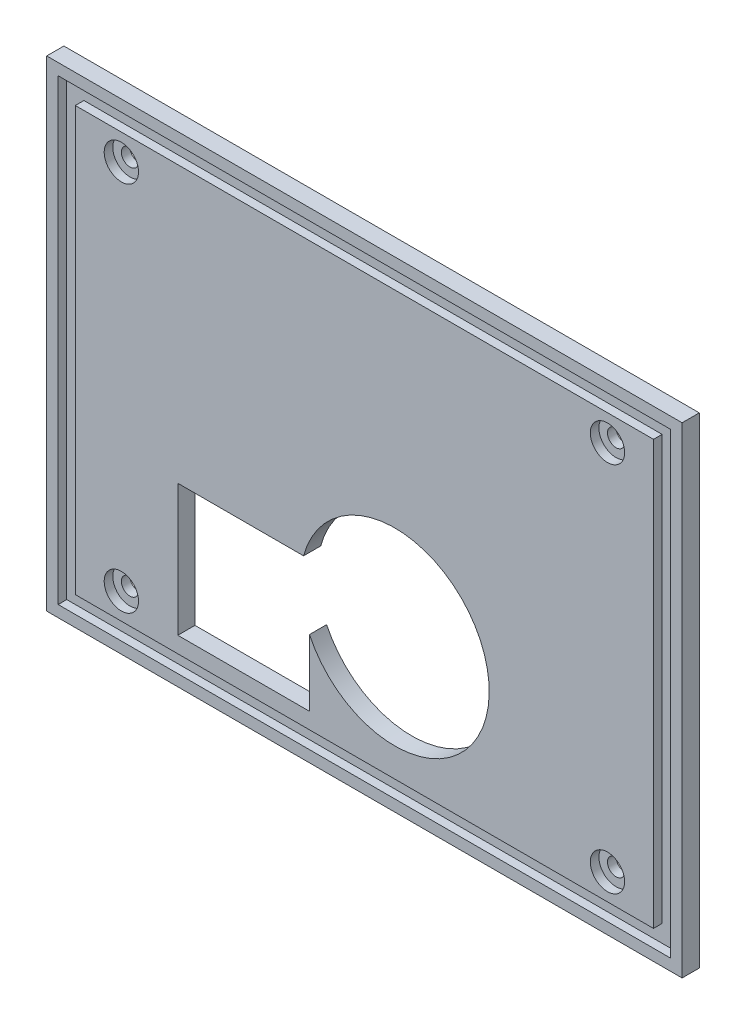
ISO-10303-21;
HEADER;
FILE_DESCRIPTION(('STEP AP214'),'2;1');
FILE_NAME('part.step','',(''),(''),'','','');
FILE_SCHEMA(('AUTOMOTIVE_DESIGN { 1 0 10303 214 1 1 1 1 }'));
ENDSEC;
DATA;
#1=APPLICATION_CONTEXT('core data for automotive mechanical design processes');
#2=APPLICATION_PROTOCOL_DEFINITION('international standard','automotive_design',2000,#1);
#3=PRODUCT_CONTEXT('',#1,'mechanical');
#4=PRODUCT('Part','Part','',(#3));
#5=PRODUCT_RELATED_PRODUCT_CATEGORY('part','',(#4));
#6=PRODUCT_DEFINITION_FORMATION('','',#4);
#7=PRODUCT_DEFINITION_CONTEXT('part definition',#1,'design');
#8=PRODUCT_DEFINITION('design','',#6,#7);
#9=PRODUCT_DEFINITION_SHAPE('','',#8);
#10=(LENGTH_UNIT() NAMED_UNIT(*) SI_UNIT(.MILLI.,.METRE.));
#11=(NAMED_UNIT(*) PLANE_ANGLE_UNIT() SI_UNIT($,.RADIAN.));
#12=(NAMED_UNIT(*) SI_UNIT($,.STERADIAN.) SOLID_ANGLE_UNIT());
#13=UNCERTAINTY_MEASURE_WITH_UNIT(LENGTH_MEASURE(1.E-05),#10,'distance_accuracy_value','');
#14=(GEOMETRIC_REPRESENTATION_CONTEXT(3) GLOBAL_UNCERTAINTY_ASSIGNED_CONTEXT((#13)) GLOBAL_UNIT_ASSIGNED_CONTEXT((#10,
#11,#12)) REPRESENTATION_CONTEXT('',''));
#15=CARTESIAN_POINT('',(0.,0.,0.));
#16=DIRECTION('',(0.,0.,1.));
#17=DIRECTION('',(1.,0.,0.));
#18=AXIS2_PLACEMENT_3D('',#15,#16,#17);
#19=CARTESIAN_POINT('',(0.,0.,0.));
#20=DIRECTION('',(0.,0.,-1.));
#21=DIRECTION('',(-1.,0.,0.));
#22=AXIS2_PLACEMENT_3D('',#19,#20,#21);
#23=PLANE('',#22);
#24=CARTESIAN_POINT('',(95.96,7.54,0.));
#25=DIRECTION('',(0.,0.,1.));
#26=DIRECTION('',(1.,0.,0.));
#27=AXIS2_PLACEMENT_3D('',#24,#25,#26);
#28=CIRCLE('',#27,1.5);
#29=CARTESIAN_POINT('',(97.46,7.54,0.));
#30=VERTEX_POINT('',#29);
#31=EDGE_CURVE('E199',#30,#30,#28,.T.);
#32=ORIENTED_EDGE('',*,*,#31,.T.);
#33=EDGE_LOOP('',(#32));
#34=FACE_BOUND('',#33,.T.);
#35=CARTESIAN_POINT('',(11.04,72.46,0.));
#36=DIRECTION('',(0.,0.,1.));
#37=DIRECTION('',(1.,0.,0.));
#38=AXIS2_PLACEMENT_3D('',#35,#36,#37);
#39=CIRCLE('',#38,1.5);
#40=CARTESIAN_POINT('',(12.54,72.46,0.));
#41=VERTEX_POINT('',#40);
#42=EDGE_CURVE('E198',#41,#41,#39,.T.);
#43=ORIENTED_EDGE('',*,*,#42,.T.);
#44=EDGE_LOOP('',(#43));
#45=FACE_BOUND('',#44,.T.);
#46=CARTESIAN_POINT('',(95.96,72.46,0.));
#47=DIRECTION('',(0.,0.,1.));
#48=DIRECTION('',(1.,0.,0.));
#49=AXIS2_PLACEMENT_3D('',#46,#47,#48);
#50=CIRCLE('',#49,1.5);
#51=CARTESIAN_POINT('',(97.46,72.46,0.));
#52=VERTEX_POINT('',#51);
#53=EDGE_CURVE('E195',#52,#52,#50,.T.);
#54=ORIENTED_EDGE('',*,*,#53,.T.);
#55=EDGE_LOOP('',(#54));
#56=FACE_BOUND('',#55,.T.);
#57=CARTESIAN_POINT('',(11.04,7.54,0.));
#58=DIRECTION('',(0.,0.,1.));
#59=DIRECTION('',(1.,0.,0.));
#60=AXIS2_PLACEMENT_3D('',#57,#58,#59);
#61=CIRCLE('',#60,1.5);
#62=CARTESIAN_POINT('',(12.54,7.54,0.));
#63=VERTEX_POINT('',#62);
#64=EDGE_CURVE('E202',#63,#63,#61,.T.);
#65=ORIENTED_EDGE('',*,*,#64,.T.);
#66=EDGE_LOOP('',(#65));
#67=FACE_BOUND('',#66,.T.);
#68=DIRECTION('',(-1.,0.,0.));
#69=VECTOR('',#68,1.);
#70=CARTESIAN_POINT('',(-2.,82.,0.));
#71=LINE('',#70,#69);
#72=CARTESIAN_POINT('',(109.,82.,0.));
#73=VERTEX_POINT('',#72);
#74=CARTESIAN_POINT('',(-2.,82.,0.));
#75=VERTEX_POINT('',#74);
#76=EDGE_CURVE('E310',#73,#75,#71,.T.);
#77=ORIENTED_EDGE('',*,*,#76,.F.);
#78=DIRECTION('',(0.,1.,0.));
#79=VECTOR('',#78,1.);
#80=CARTESIAN_POINT('',(109.,-2.,0.));
#81=LINE('',#80,#79);
#82=CARTESIAN_POINT('',(109.,-2.,0.));
#83=VERTEX_POINT('',#82);
#84=EDGE_CURVE('E308',#83,#73,#81,.T.);
#85=ORIENTED_EDGE('',*,*,#84,.F.);
#86=DIRECTION('',(1.,0.,0.));
#87=VECTOR('',#86,1.);
#88=CARTESIAN_POINT('',(-2.,-2.,0.));
#89=LINE('',#88,#87);
#90=CARTESIAN_POINT('',(-2.,-2.,0.));
#91=VERTEX_POINT('',#90);
#92=EDGE_CURVE('E306',#91,#83,#89,.T.);
#93=ORIENTED_EDGE('',*,*,#92,.F.);
#94=DIRECTION('',(0.,-1.,0.));
#95=VECTOR('',#94,1.);
#96=CARTESIAN_POINT('',(-2.,-2.,0.));
#97=LINE('',#96,#95);
#98=EDGE_CURVE('E304',#75,#91,#97,.T.);
#99=ORIENTED_EDGE('',*,*,#98,.F.);
#100=EDGE_LOOP('',(#77,#85,#93,#99));
#101=FACE_BOUND('',#100,.T.);
#102=DIRECTION('',(1.,0.,0.));
#103=VECTOR('',#102,1.);
#104=CARTESIAN_POINT('',(20.9,5.8,0.));
#105=LINE('',#104,#103);
#106=CARTESIAN_POINT('',(20.9,5.8,0.));
#107=VERTEX_POINT('',#106);
#108=CARTESIAN_POINT('',(43.9,5.8,0.));
#109=VERTEX_POINT('',#108);
#110=EDGE_CURVE('E173',#107,#109,#105,.T.);
#111=ORIENTED_EDGE('',*,*,#110,.T.);
#112=DIRECTION('',(0.,1.,0.));
#113=VECTOR('',#112,1.);
#114=CARTESIAN_POINT('',(43.9,5.8,0.));
#115=LINE('',#114,#113);
#116=CARTESIAN_POINT('',(43.9,17.4119819413322,0.));
#117=VERTEX_POINT('',#116);
#118=EDGE_CURVE('E179',#109,#117,#115,.T.);
#119=ORIENTED_EDGE('',*,*,#118,.T.);
#120=CARTESIAN_POINT('',(58.8,24.5,0.));
#121=DIRECTION('',(0.,0.,1.));
#122=DIRECTION('',(1.,0.,0.));
#123=AXIS2_PLACEMENT_3D('',#120,#121,#122);
#124=CIRCLE('',#123,16.5);
#125=CARTESIAN_POINT('',(42.8701537986081,28.8,0.));
#126=VERTEX_POINT('',#125);
#127=EDGE_CURVE('E192',#117,#126,#124,.T.);
#128=ORIENTED_EDGE('',*,*,#127,.T.);
#129=DIRECTION('',(-1.,0.,0.));
#130=VECTOR('',#129,1.);
#131=CARTESIAN_POINT('',(20.9,28.8,0.));
#132=LINE('',#131,#130);
#133=CARTESIAN_POINT('',(20.9,28.8,0.));
#134=VERTEX_POINT('',#133);
#135=EDGE_CURVE('E56',#126,#134,#132,.T.);
#136=ORIENTED_EDGE('',*,*,#135,.T.);
#137=DIRECTION('',(0.,-1.,0.));
#138=VECTOR('',#137,1.);
#139=CARTESIAN_POINT('',(20.9,5.8,0.));
#140=LINE('',#139,#138);
#141=EDGE_CURVE('E165',#134,#107,#140,.T.);
#142=ORIENTED_EDGE('',*,*,#141,.T.);
#143=EDGE_LOOP('',(#111,#119,#128,#136,#142));
#144=FACE_BOUND('',#143,.T.);
#145=ADVANCED_FACE('F41',(#34,#45,#56,#67,#101,#144),#23,.T.);
#146=CARTESIAN_POINT('',(0.,0.,3.));
#147=DIRECTION('',(0.,0.,-1.));
#148=DIRECTION('',(-1.,0.,0.));
#149=AXIS2_PLACEMENT_3D('',#146,#147,#148);
#150=PLANE('',#149);
#151=CARTESIAN_POINT('',(95.96,72.46,3.));
#152=DIRECTION('',(0.,0.,1.));
#153=DIRECTION('',(1.,0.,0.));
#154=AXIS2_PLACEMENT_3D('',#151,#152,#153);
#155=CIRCLE('',#154,3.00000000000001);
#156=CARTESIAN_POINT('',(98.96,72.46,3.));
#157=VERTEX_POINT('',#156);
#158=EDGE_CURVE('E247',#157,#157,#155,.T.);
#159=ORIENTED_EDGE('',*,*,#158,.F.);
#160=EDGE_LOOP('',(#159));
#161=FACE_BOUND('',#160,.T.);
#162=CARTESIAN_POINT('',(11.04,72.46,3.));
#163=DIRECTION('',(0.,0.,1.));
#164=DIRECTION('',(1.,0.,0.));
#165=AXIS2_PLACEMENT_3D('',#162,#163,#164);
#166=CIRCLE('',#165,3.);
#167=CARTESIAN_POINT('',(14.04,72.46,3.));
#168=VERTEX_POINT('',#167);
#169=EDGE_CURVE('E250',#168,#168,#166,.T.);
#170=ORIENTED_EDGE('',*,*,#169,.F.);
#171=EDGE_LOOP('',(#170));
#172=FACE_BOUND('',#171,.T.);
#173=CARTESIAN_POINT('',(95.96,7.54,3.));
#174=DIRECTION('',(0.,0.,1.));
#175=DIRECTION('',(1.,0.,0.));
#176=AXIS2_PLACEMENT_3D('',#173,#174,#175);
#177=CIRCLE('',#176,3.00000000000001);
#178=CARTESIAN_POINT('',(98.96,7.54,3.));
#179=VERTEX_POINT('',#178);
#180=EDGE_CURVE('E253',#179,#179,#177,.T.);
#181=ORIENTED_EDGE('',*,*,#180,.F.);
#182=EDGE_LOOP('',(#181));
#183=FACE_BOUND('',#182,.T.);
#184=CARTESIAN_POINT('',(11.04,7.54,3.));
#185=DIRECTION('',(0.,0.,1.));
#186=DIRECTION('',(1.,0.,0.));
#187=AXIS2_PLACEMENT_3D('',#184,#185,#186);
#188=CIRCLE('',#187,3.);
#189=CARTESIAN_POINT('',(14.04,7.54,3.));
#190=VERTEX_POINT('',#189);
#191=EDGE_CURVE('E256',#190,#190,#188,.T.);
#192=ORIENTED_EDGE('',*,*,#191,.F.);
#193=EDGE_LOOP('',(#192));
#194=FACE_BOUND('',#193,.T.);
#195=DIRECTION('',(0.,-1.,0.));
#196=VECTOR('',#195,1.);
#197=CARTESIAN_POINT('',(3.,3.,3.));
#198=LINE('',#197,#196);
#199=CARTESIAN_POINT('',(3.,77.,3.));
#200=VERTEX_POINT('',#199);
#201=CARTESIAN_POINT('',(3.,3.,3.));
#202=VERTEX_POINT('',#201);
#203=EDGE_CURVE('E259',#200,#202,#198,.T.);
#204=ORIENTED_EDGE('',*,*,#203,.T.);
#205=DIRECTION('',(1.,0.,0.));
#206=VECTOR('',#205,1.);
#207=CARTESIAN_POINT('',(3.,3.,3.));
#208=LINE('',#207,#206);
#209=CARTESIAN_POINT('',(104.,3.,3.));
#210=VERTEX_POINT('',#209);
#211=EDGE_CURVE('E262',#202,#210,#208,.T.);
#212=ORIENTED_EDGE('',*,*,#211,.T.);
#213=DIRECTION('',(0.,1.,0.));
#214=VECTOR('',#213,1.);
#215=CARTESIAN_POINT('',(104.,3.,3.));
#216=LINE('',#215,#214);
#217=CARTESIAN_POINT('',(104.,77.,3.));
#218=VERTEX_POINT('',#217);
#219=EDGE_CURVE('E264',#210,#218,#216,.T.);
#220=ORIENTED_EDGE('',*,*,#219,.T.);
#221=DIRECTION('',(-1.,0.,0.));
#222=VECTOR('',#221,1.);
#223=CARTESIAN_POINT('',(3.,77.,3.));
#224=LINE('',#223,#222);
#225=EDGE_CURVE('E266',#218,#200,#224,.T.);
#226=ORIENTED_EDGE('',*,*,#225,.T.);
#227=EDGE_LOOP('',(#204,#212,#220,#226));
#228=FACE_BOUND('',#227,.T.);
#229=DIRECTION('',(0.,1.,0.));
#230=VECTOR('',#229,1.);
#231=CARTESIAN_POINT('',(43.9,0.,3.));
#232=LINE('',#231,#230);
#233=CARTESIAN_POINT('',(43.9,5.8,3.));
#234=VERTEX_POINT('',#233);
#235=CARTESIAN_POINT('',(43.9,17.4119819413322,3.));
#236=VERTEX_POINT('',#235);
#237=EDGE_CURVE('E190',#234,#236,#232,.T.);
#238=ORIENTED_EDGE('',*,*,#237,.F.);
#239=DIRECTION('',(1.,0.,0.));
#240=VECTOR('',#239,1.);
#241=CARTESIAN_POINT('',(0.,5.8,3.));
#242=LINE('',#241,#240);
#243=CARTESIAN_POINT('',(20.9,5.8,3.));
#244=VERTEX_POINT('',#243);
#245=EDGE_CURVE('E11',#244,#234,#242,.T.);
#246=ORIENTED_EDGE('',*,*,#245,.F.);
#247=DIRECTION('',(0.,-1.,0.));
#248=VECTOR('',#247,1.);
#249=CARTESIAN_POINT('',(20.9,0.,3.));
#250=LINE('',#249,#248);
#251=CARTESIAN_POINT('',(20.9,28.8,3.));
#252=VERTEX_POINT('',#251);
#253=EDGE_CURVE('E49',#252,#244,#250,.T.);
#254=ORIENTED_EDGE('',*,*,#253,.F.);
#255=DIRECTION('',(-1.,0.,0.));
#256=VECTOR('',#255,1.);
#257=CARTESIAN_POINT('',(0.,28.8,3.));
#258=LINE('',#257,#256);
#259=CARTESIAN_POINT('',(42.8701537986081,28.8,3.));
#260=VERTEX_POINT('',#259);
#261=EDGE_CURVE('E169',#260,#252,#258,.T.);
#262=ORIENTED_EDGE('',*,*,#261,.F.);
#263=CARTESIAN_POINT('',(58.8,24.5,3.));
#264=DIRECTION('',(0.,0.,-1.));
#265=DIRECTION('',(-1.,0.,0.));
#266=AXIS2_PLACEMENT_3D('',#263,#264,#265);
#267=CIRCLE('',#266,16.5);
#268=EDGE_CURVE('E194',#236,#260,#267,.F.);
#269=ORIENTED_EDGE('',*,*,#268,.F.);
#270=EDGE_LOOP('',(#238,#246,#254,#262,#269));
#271=FACE_BOUND('',#270,.T.);
#272=ADVANCED_FACE('F348',(#161,#172,#183,#194,#228,#271),#150,.F.);
#273=CARTESIAN_POINT('',(58.8,24.5,6.));
#274=DIRECTION('',(0.,0.,-1.));
#275=DIRECTION('',(-1.,0.,0.));
#276=AXIS2_PLACEMENT_3D('',#273,#274,#275);
#277=CYLINDRICAL_SURFACE('',#276,16.5);
#278=ORIENTED_EDGE('',*,*,#127,.F.);
#279=DIRECTION('',(0.,0.,-1.));
#280=VECTOR('',#279,1.);
#281=CARTESIAN_POINT('',(43.9,17.4119819413322,6.));
#282=LINE('',#281,#280);
#283=EDGE_CURVE('E338',#117,#236,#282,.F.);
#284=ORIENTED_EDGE('',*,*,#283,.T.);
#285=ORIENTED_EDGE('',*,*,#268,.T.);
#286=DIRECTION('',(0.,0.,-1.));
#287=VECTOR('',#286,1.);
#288=CARTESIAN_POINT('',(42.8701537986081,28.8,6.));
#289=LINE('',#288,#287);
#290=EDGE_CURVE('E324',#260,#126,#289,.T.);
#291=ORIENTED_EDGE('',*,*,#290,.T.);
#292=EDGE_LOOP('',(#278,#284,#285,#291));
#293=FACE_BOUND('',#292,.T.);
#294=ADVANCED_FACE('F343',(#293),#277,.F.);
#295=CARTESIAN_POINT('',(0.,0.,1.5));
#296=DIRECTION('',(0.,0.,-1.));
#297=DIRECTION('',(-1.,0.,0.));
#298=AXIS2_PLACEMENT_3D('',#295,#296,#297);
#299=PLANE('',#298);
#300=DIRECTION('',(0.,-1.,0.));
#301=VECTOR('',#300,1.);
#302=CARTESIAN_POINT('',(3.,0.,1.5));
#303=LINE('',#302,#301);
#304=CARTESIAN_POINT('',(3.,77.,1.5));
#305=VERTEX_POINT('',#304);
#306=CARTESIAN_POINT('',(3.,3.,1.5));
#307=VERTEX_POINT('',#306);
#308=EDGE_CURVE('E301',#305,#307,#303,.T.);
#309=ORIENTED_EDGE('',*,*,#308,.F.);
#310=DIRECTION('',(-1.,0.,0.));
#311=VECTOR('',#310,1.);
#312=CARTESIAN_POINT('',(0.,77.,1.5));
#313=LINE('',#312,#311);
#314=CARTESIAN_POINT('',(104.,77.,1.5));
#315=VERTEX_POINT('',#314);
#316=EDGE_CURVE('E292',#315,#305,#313,.T.);
#317=ORIENTED_EDGE('',*,*,#316,.F.);
#318=DIRECTION('',(0.,1.,0.));
#319=VECTOR('',#318,1.);
#320=CARTESIAN_POINT('',(104.,0.,1.5));
#321=LINE('',#320,#319);
#322=CARTESIAN_POINT('',(104.,3.,1.5));
#323=VERTEX_POINT('',#322);
#324=EDGE_CURVE('E295',#323,#315,#321,.T.);
#325=ORIENTED_EDGE('',*,*,#324,.F.);
#326=DIRECTION('',(1.,0.,0.));
#327=VECTOR('',#326,1.);
#328=CARTESIAN_POINT('',(0.,3.,1.5));
#329=LINE('',#328,#327);
#330=EDGE_CURVE('E298',#307,#323,#329,.T.);
#331=ORIENTED_EDGE('',*,*,#330,.F.);
#332=EDGE_LOOP('',(#309,#317,#325,#331));
#333=FACE_BOUND('',#332,.T.);
#334=DIRECTION('',(0.,-1.,0.));
#335=VECTOR('',#334,1.);
#336=CARTESIAN_POINT('',(107.,0.,1.5));
#337=LINE('',#336,#335);
#338=CARTESIAN_POINT('',(107.,80.,1.5));
#339=VERTEX_POINT('',#338);
#340=CARTESIAN_POINT('',(107.,0.,1.5));
#341=VERTEX_POINT('',#340);
#342=EDGE_CURVE('E216',#339,#341,#337,.T.);
#343=ORIENTED_EDGE('',*,*,#342,.F.);
#344=DIRECTION('',(1.,0.,0.));
#345=VECTOR('',#344,1.);
#346=CARTESIAN_POINT('',(0.,80.,1.5));
#347=LINE('',#346,#345);
#348=CARTESIAN_POINT('',(0.,80.,1.5));
#349=VERTEX_POINT('',#348);
#350=EDGE_CURVE('E232',#349,#339,#347,.T.);
#351=ORIENTED_EDGE('',*,*,#350,.F.);
#352=DIRECTION('',(0.,1.,0.));
#353=VECTOR('',#352,1.);
#354=CARTESIAN_POINT('',(0.,0.,1.5));
#355=LINE('',#354,#353);
#356=CARTESIAN_POINT('',(0.,0.,1.5));
#357=VERTEX_POINT('',#356);
#358=EDGE_CURVE('E224',#357,#349,#355,.T.);
#359=ORIENTED_EDGE('',*,*,#358,.F.);
#360=DIRECTION('',(-1.,0.,0.));
#361=VECTOR('',#360,1.);
#362=CARTESIAN_POINT('',(0.,0.,1.5));
#363=LINE('',#362,#361);
#364=EDGE_CURVE('E245',#341,#357,#363,.T.);
#365=ORIENTED_EDGE('',*,*,#364,.F.);
#366=EDGE_LOOP('',(#343,#351,#359,#365));
#367=FACE_BOUND('',#366,.T.);
#368=ADVANCED_FACE('F371',(#333,#367),#299,.F.);
#369=CARTESIAN_POINT('',(-2.,0.,3.));
#370=DIRECTION('',(0.,-1.,0.));
#371=DIRECTION('',(0.,0.,-1.));
#372=AXIS2_PLACEMENT_3D('',#369,#370,#371);
#373=PLANE('',#372);
#374=DIRECTION('',(0.,0.,-1.));
#375=VECTOR('',#374,1.);
#376=CARTESIAN_POINT('',(107.,0.,3.));
#377=LINE('',#376,#375);
#378=CARTESIAN_POINT('',(107.,0.,3.));
#379=VERTEX_POINT('',#378);
#380=EDGE_CURVE('E213',#379,#341,#377,.T.);
#381=ORIENTED_EDGE('',*,*,#380,.T.);
#382=ORIENTED_EDGE('',*,*,#364,.T.);
#383=DIRECTION('',(0.,0.,-1.));
#384=VECTOR('',#383,1.);
#385=CARTESIAN_POINT('',(0.,0.,3.));
#386=LINE('',#385,#384);
#387=CARTESIAN_POINT('',(0.,0.,3.));
#388=VERTEX_POINT('',#387);
#389=EDGE_CURVE('E221',#388,#357,#386,.T.);
#390=ORIENTED_EDGE('',*,*,#389,.F.);
#391=DIRECTION('',(-1.,0.,0.));
#392=VECTOR('',#391,1.);
#393=CARTESIAN_POINT('',(-2.,0.,3.));
#394=LINE('',#393,#392);
#395=EDGE_CURVE('E243',#379,#388,#394,.T.);
#396=ORIENTED_EDGE('',*,*,#395,.F.);
#397=EDGE_LOOP('',(#381,#382,#390,#396));
#398=FACE_BOUND('',#397,.T.);
#399=ADVANCED_FACE('F419',(#398),#373,.F.);
#400=CARTESIAN_POINT('',(-2.,80.,3.));
#401=DIRECTION('',(0.,1.,0.));
#402=DIRECTION('',(0.,0.,1.));
#403=AXIS2_PLACEMENT_3D('',#400,#401,#402);
#404=PLANE('',#403);
#405=DIRECTION('',(0.,0.,-1.));
#406=VECTOR('',#405,1.);
#407=CARTESIAN_POINT('',(107.,80.,3.));
#408=LINE('',#407,#406);
#409=CARTESIAN_POINT('',(107.,80.,3.));
#410=VERTEX_POINT('',#409);
#411=EDGE_CURVE('E210',#410,#339,#408,.T.);
#412=ORIENTED_EDGE('',*,*,#411,.F.);
#413=DIRECTION('',(1.,0.,0.));
#414=VECTOR('',#413,1.);
#415=CARTESIAN_POINT('',(-2.,80.,3.));
#416=LINE('',#415,#414);
#417=CARTESIAN_POINT('',(0.,80.,3.));
#418=VERTEX_POINT('',#417);
#419=EDGE_CURVE('E226',#418,#410,#416,.T.);
#420=ORIENTED_EDGE('',*,*,#419,.F.);
#421=DIRECTION('',(0.,0.,-1.));
#422=VECTOR('',#421,1.);
#423=CARTESIAN_POINT('',(0.,80.,3.));
#424=LINE('',#423,#422);
#425=EDGE_CURVE('E64',#418,#349,#424,.T.);
#426=ORIENTED_EDGE('',*,*,#425,.T.);
#427=ORIENTED_EDGE('',*,*,#350,.T.);
#428=EDGE_LOOP('',(#412,#420,#426,#427));
#429=FACE_BOUND('',#428,.T.);
#430=ADVANCED_FACE('F388',(#429),#404,.F.);
#431=CARTESIAN_POINT('',(-2.,-2.,1.5));
#432=DIRECTION('',(1.,0.,0.));
#433=DIRECTION('',(0.,0.,-1.));
#434=AXIS2_PLACEMENT_3D('',#431,#432,#433);
#435=PLANE('',#434);
#436=ORIENTED_EDGE('',*,*,#98,.T.);
#437=DIRECTION('',(0.,0.,-1.));
#438=VECTOR('',#437,1.);
#439=CARTESIAN_POINT('',(-2.,-2.,1.5));
#440=LINE('',#439,#438);
#441=CARTESIAN_POINT('',(-2.,-2.,3.));
#442=VERTEX_POINT('',#441);
#443=EDGE_CURVE('E321',#442,#91,#440,.T.);
#444=ORIENTED_EDGE('',*,*,#443,.F.);
#445=DIRECTION('',(0.,-1.,0.));
#446=VECTOR('',#445,1.);
#447=CARTESIAN_POINT('',(-2.,-2.,3.));
#448=LINE('',#447,#446);
#449=CARTESIAN_POINT('',(-2.,82.,3.));
#450=VERTEX_POINT('',#449);
#451=EDGE_CURVE('E235',#450,#442,#448,.T.);
#452=ORIENTED_EDGE('',*,*,#451,.F.);
#453=DIRECTION('',(0.,0.,-1.));
#454=VECTOR('',#453,1.);
#455=CARTESIAN_POINT('',(-2.,82.,1.5));
#456=LINE('',#455,#454);
#457=EDGE_CURVE('E312',#450,#75,#456,.T.);
#458=ORIENTED_EDGE('',*,*,#457,.T.);
#459=EDGE_LOOP('',(#436,#444,#452,#458));
#460=FACE_BOUND('',#459,.T.);
#461=ADVANCED_FACE('F43',(#460),#435,.F.);
#462=CARTESIAN_POINT('',(-2.,-2.,1.5));
#463=DIRECTION('',(0.,1.,0.));
#464=DIRECTION('',(0.,0.,1.));
#465=AXIS2_PLACEMENT_3D('',#462,#463,#464);
#466=PLANE('',#465);
#467=ORIENTED_EDGE('',*,*,#92,.T.);
#468=DIRECTION('',(0.,0.,-1.));
#469=VECTOR('',#468,1.);
#470=CARTESIAN_POINT('',(109.,-2.,1.5));
#471=LINE('',#470,#469);
#472=CARTESIAN_POINT('',(109.,-2.,3.));
#473=VERTEX_POINT('',#472);
#474=EDGE_CURVE('E318',#473,#83,#471,.T.);
#475=ORIENTED_EDGE('',*,*,#474,.F.);
#476=DIRECTION('',(1.,0.,0.));
#477=VECTOR('',#476,1.);
#478=CARTESIAN_POINT('',(-2.,-2.,3.));
#479=LINE('',#478,#477);
#480=EDGE_CURVE('E238',#442,#473,#479,.T.);
#481=ORIENTED_EDGE('',*,*,#480,.F.);
#482=ORIENTED_EDGE('',*,*,#443,.T.);
#483=EDGE_LOOP('',(#467,#475,#481,#482));
#484=FACE_BOUND('',#483,.T.);
#485=ADVANCED_FACE('F380',(#484),#466,.F.);
#486=CARTESIAN_POINT('',(109.,-2.,1.5));
#487=DIRECTION('',(-1.,0.,0.));
#488=DIRECTION('',(0.,0.,1.));
#489=AXIS2_PLACEMENT_3D('',#486,#487,#488);
#490=PLANE('',#489);
#491=DIRECTION('',(0.,0.,-1.));
#492=VECTOR('',#491,1.);
#493=CARTESIAN_POINT('',(109.,82.,1.5));
#494=LINE('',#493,#492);
#495=CARTESIAN_POINT('',(109.,82.,3.));
#496=VERTEX_POINT('',#495);
#497=EDGE_CURVE('E315',#496,#73,#494,.T.);
#498=ORIENTED_EDGE('',*,*,#497,.F.);
#499=DIRECTION('',(0.,1.,0.));
#500=VECTOR('',#499,1.);
#501=CARTESIAN_POINT('',(109.,-2.,3.));
#502=LINE('',#501,#500);
#503=EDGE_CURVE('E241',#473,#496,#502,.T.);
#504=ORIENTED_EDGE('',*,*,#503,.F.);
#505=ORIENTED_EDGE('',*,*,#474,.T.);
#506=ORIENTED_EDGE('',*,*,#84,.T.);
#507=EDGE_LOOP('',(#498,#504,#505,#506));
#508=FACE_BOUND('',#507,.T.);
#509=ADVANCED_FACE('F377',(#508),#490,.F.);
#510=CARTESIAN_POINT('',(-2.,82.,1.5));
#511=DIRECTION('',(0.,-1.,0.));
#512=DIRECTION('',(0.,0.,-1.));
#513=AXIS2_PLACEMENT_3D('',#510,#511,#512);
#514=PLANE('',#513);
#515=ORIENTED_EDGE('',*,*,#76,.T.);
#516=ORIENTED_EDGE('',*,*,#457,.F.);
#517=DIRECTION('',(-1.,0.,0.));
#518=VECTOR('',#517,1.);
#519=CARTESIAN_POINT('',(-2.,82.,3.));
#520=LINE('',#519,#518);
#521=EDGE_CURVE('E229',#496,#450,#520,.T.);
#522=ORIENTED_EDGE('',*,*,#521,.F.);
#523=ORIENTED_EDGE('',*,*,#497,.T.);
#524=EDGE_LOOP('',(#515,#516,#522,#523));
#525=FACE_BOUND('',#524,.T.);
#526=ADVANCED_FACE('F373',(#525),#514,.F.);
#527=CARTESIAN_POINT('',(3.,3.,3.));
#528=DIRECTION('',(1.,0.,0.));
#529=DIRECTION('',(0.,0.,-1.));
#530=AXIS2_PLACEMENT_3D('',#527,#528,#529);
#531=PLANE('',#530);
#532=DIRECTION('',(0.,0.,-1.));
#533=VECTOR('',#532,1.);
#534=CARTESIAN_POINT('',(3.,77.,3.));
#535=LINE('',#534,#533);
#536=EDGE_CURVE('E268',#200,#305,#535,.T.);
#537=ORIENTED_EDGE('',*,*,#536,.T.);
#538=ORIENTED_EDGE('',*,*,#308,.T.);
#539=DIRECTION('',(0.,0.,-1.));
#540=VECTOR('',#539,1.);
#541=CARTESIAN_POINT('',(3.,3.,3.));
#542=LINE('',#541,#540);
#543=EDGE_CURVE('E277',#202,#307,#542,.T.);
#544=ORIENTED_EDGE('',*,*,#543,.F.);
#545=ORIENTED_EDGE('',*,*,#203,.F.);
#546=EDGE_LOOP('',(#537,#538,#544,#545));
#547=FACE_BOUND('',#546,.T.);
#548=ADVANCED_FACE('F376',(#547),#531,.F.);
#549=CARTESIAN_POINT('',(3.,3.,3.));
#550=DIRECTION('',(0.,1.,0.));
#551=DIRECTION('',(0.,0.,1.));
#552=AXIS2_PLACEMENT_3D('',#549,#550,#551);
#553=PLANE('',#552);
#554=ORIENTED_EDGE('',*,*,#543,.T.);
#555=ORIENTED_EDGE('',*,*,#330,.T.);
#556=DIRECTION('',(0.,0.,-1.));
#557=VECTOR('',#556,1.);
#558=CARTESIAN_POINT('',(104.,3.,3.));
#559=LINE('',#558,#557);
#560=EDGE_CURVE('E274',#210,#323,#559,.T.);
#561=ORIENTED_EDGE('',*,*,#560,.F.);
#562=ORIENTED_EDGE('',*,*,#211,.F.);
#563=EDGE_LOOP('',(#554,#555,#561,#562));
#564=FACE_BOUND('',#563,.T.);
#565=ADVANCED_FACE('F445',(#564),#553,.F.);
#566=CARTESIAN_POINT('',(104.,3.,3.));
#567=DIRECTION('',(-1.,0.,0.));
#568=DIRECTION('',(0.,0.,1.));
#569=AXIS2_PLACEMENT_3D('',#566,#567,#568);
#570=PLANE('',#569);
#571=ORIENTED_EDGE('',*,*,#560,.T.);
#572=ORIENTED_EDGE('',*,*,#324,.T.);
#573=DIRECTION('',(0.,0.,-1.));
#574=VECTOR('',#573,1.);
#575=CARTESIAN_POINT('',(104.,77.,3.));
#576=LINE('',#575,#574);
#577=EDGE_CURVE('E271',#218,#315,#576,.T.);
#578=ORIENTED_EDGE('',*,*,#577,.F.);
#579=ORIENTED_EDGE('',*,*,#219,.F.);
#580=EDGE_LOOP('',(#571,#572,#578,#579));
#581=FACE_BOUND('',#580,.T.);
#582=ADVANCED_FACE('F441',(#581),#570,.F.);
#583=CARTESIAN_POINT('',(3.,77.,3.));
#584=DIRECTION('',(0.,-1.,0.));
#585=DIRECTION('',(0.,0.,-1.));
#586=AXIS2_PLACEMENT_3D('',#583,#584,#585);
#587=PLANE('',#586);
#588=ORIENTED_EDGE('',*,*,#577,.T.);
#589=ORIENTED_EDGE('',*,*,#316,.T.);
#590=ORIENTED_EDGE('',*,*,#536,.F.);
#591=ORIENTED_EDGE('',*,*,#225,.F.);
#592=EDGE_LOOP('',(#588,#589,#590,#591));
#593=FACE_BOUND('',#592,.T.);
#594=ADVANCED_FACE('F436',(#593),#587,.F.);
#595=CARTESIAN_POINT('',(11.04,7.54,3.));
#596=DIRECTION('',(0.,0.,-1.));
#597=DIRECTION('',(-1.,0.,0.));
#598=AXIS2_PLACEMENT_3D('',#595,#596,#597);
#599=CYLINDRICAL_SURFACE('',#598,3.);
#600=ORIENTED_EDGE('',*,*,#191,.T.);
#601=EDGE_LOOP('',(#600));
#602=FACE_BOUND('',#601,.T.);
#603=CARTESIAN_POINT('',(11.04,7.54,1.5));
#604=DIRECTION('',(0.,0.,-1.));
#605=DIRECTION('',(-1.,0.,0.));
#606=AXIS2_PLACEMENT_3D('',#603,#604,#605);
#607=CIRCLE('',#606,3.);
#608=CARTESIAN_POINT('',(8.04,7.54,1.5));
#609=VERTEX_POINT('',#608);
#610=EDGE_CURVE('E289',#609,#609,#607,.F.);
#611=ORIENTED_EDGE('',*,*,#610,.F.);
#612=EDGE_LOOP('',(#611));
#613=FACE_BOUND('',#612,.T.);
#614=ADVANCED_FACE('F433',(#602,#613),#599,.F.);
#615=CARTESIAN_POINT('',(95.96,7.54,3.));
#616=DIRECTION('',(0.,0.,-1.));
#617=DIRECTION('',(-1.,0.,0.));
#618=AXIS2_PLACEMENT_3D('',#615,#616,#617);
#619=CYLINDRICAL_SURFACE('',#618,3.00000000000001);
#620=ORIENTED_EDGE('',*,*,#180,.T.);
#621=EDGE_LOOP('',(#620));
#622=FACE_BOUND('',#621,.T.);
#623=CARTESIAN_POINT('',(95.96,7.54,1.5));
#624=DIRECTION('',(0.,0.,-1.));
#625=DIRECTION('',(-1.,0.,0.));
#626=AXIS2_PLACEMENT_3D('',#623,#624,#625);
#627=CIRCLE('',#626,3.00000000000001);
#628=CARTESIAN_POINT('',(92.96,7.54,1.5));
#629=VERTEX_POINT('',#628);
#630=EDGE_CURVE('E286',#629,#629,#627,.F.);
#631=ORIENTED_EDGE('',*,*,#630,.F.);
#632=EDGE_LOOP('',(#631));
#633=FACE_BOUND('',#632,.T.);
#634=ADVANCED_FACE('F429',(#622,#633),#619,.F.);
#635=CARTESIAN_POINT('',(11.04,72.46,3.));
#636=DIRECTION('',(0.,0.,-1.));
#637=DIRECTION('',(-1.,0.,0.));
#638=AXIS2_PLACEMENT_3D('',#635,#636,#637);
#639=CYLINDRICAL_SURFACE('',#638,3.);
#640=ORIENTED_EDGE('',*,*,#169,.T.);
#641=EDGE_LOOP('',(#640));
#642=FACE_BOUND('',#641,.T.);
#643=CARTESIAN_POINT('',(11.04,72.46,1.5));
#644=DIRECTION('',(0.,0.,-1.));
#645=DIRECTION('',(-1.,0.,0.));
#646=AXIS2_PLACEMENT_3D('',#643,#644,#645);
#647=CIRCLE('',#646,3.);
#648=CARTESIAN_POINT('',(8.04,72.46,1.5));
#649=VERTEX_POINT('',#648);
#650=EDGE_CURVE('E283',#649,#649,#647,.F.);
#651=ORIENTED_EDGE('',*,*,#650,.F.);
#652=EDGE_LOOP('',(#651));
#653=FACE_BOUND('',#652,.T.);
#654=ADVANCED_FACE('F425',(#642,#653),#639,.F.);
#655=CARTESIAN_POINT('',(95.96,72.46,3.));
#656=DIRECTION('',(0.,0.,-1.));
#657=DIRECTION('',(-1.,0.,0.));
#658=AXIS2_PLACEMENT_3D('',#655,#656,#657);
#659=CYLINDRICAL_SURFACE('',#658,3.00000000000001);
#660=ORIENTED_EDGE('',*,*,#158,.T.);
#661=EDGE_LOOP('',(#660));
#662=FACE_BOUND('',#661,.T.);
#663=CARTESIAN_POINT('',(95.96,72.46,1.5));
#664=DIRECTION('',(0.,0.,-1.));
#665=DIRECTION('',(-1.,0.,0.));
#666=AXIS2_PLACEMENT_3D('',#663,#664,#665);
#667=CIRCLE('',#666,3.00000000000001);
#668=CARTESIAN_POINT('',(92.96,72.46,1.5));
#669=VERTEX_POINT('',#668);
#670=EDGE_CURVE('E280',#669,#669,#667,.F.);
#671=ORIENTED_EDGE('',*,*,#670,.F.);
#672=EDGE_LOOP('',(#671));
#673=FACE_BOUND('',#672,.T.);
#674=ADVANCED_FACE('F423',(#662,#673),#659,.F.);
#675=CARTESIAN_POINT('',(11.04,72.46,1.5));
#676=DIRECTION('',(0.,0.,-1.));
#677=DIRECTION('',(-1.,0.,0.));
#678=AXIS2_PLACEMENT_3D('',#675,#676,#677);
#679=CIRCLE('',#678,1.5);
#680=CARTESIAN_POINT('',(9.54,72.46,1.5));
#681=VERTEX_POINT('',#680);
#682=EDGE_CURVE('E211',#681,#681,#679,.F.);
#683=ORIENTED_EDGE('',*,*,#682,.F.);
#684=EDGE_LOOP('',(#683));
#685=FACE_BOUND('',#684,.T.);
#686=ORIENTED_EDGE('',*,*,#650,.T.);
#687=EDGE_LOOP('',(#686));
#688=FACE_BOUND('',#687,.T.);
#689=ADVANCED_FACE('F416',(#685,#688),#299,.F.);
#690=CARTESIAN_POINT('',(95.96,7.54,1.5));
#691=DIRECTION('',(0.,0.,-1.));
#692=DIRECTION('',(-1.,0.,0.));
#693=AXIS2_PLACEMENT_3D('',#690,#691,#692);
#694=CIRCLE('',#693,1.5);
#695=CARTESIAN_POINT('',(94.46,7.54,1.5));
#696=VERTEX_POINT('',#695);
#697=EDGE_CURVE('E330',#696,#696,#694,.F.);
#698=ORIENTED_EDGE('',*,*,#697,.F.);
#699=EDGE_LOOP('',(#698));
#700=FACE_BOUND('',#699,.T.);
#701=ORIENTED_EDGE('',*,*,#630,.T.);
#702=EDGE_LOOP('',(#701));
#703=FACE_BOUND('',#702,.T.);
#704=ADVANCED_FACE('F636',(#700,#703),#299,.F.);
#705=CARTESIAN_POINT('',(11.04,7.54,1.5));
#706=DIRECTION('',(0.,0.,-1.));
#707=DIRECTION('',(-1.,0.,0.));
#708=AXIS2_PLACEMENT_3D('',#705,#706,#707);
#709=CIRCLE('',#708,1.5);
#710=CARTESIAN_POINT('',(9.54,7.54,1.5));
#711=VERTEX_POINT('',#710);
#712=EDGE_CURVE('E327',#711,#711,#709,.F.);
#713=ORIENTED_EDGE('',*,*,#712,.F.);
#714=EDGE_LOOP('',(#713));
#715=FACE_BOUND('',#714,.T.);
#716=ORIENTED_EDGE('',*,*,#610,.T.);
#717=EDGE_LOOP('',(#716));
#718=FACE_BOUND('',#717,.T.);
#719=ADVANCED_FACE('F414',(#715,#718),#299,.F.);
#720=CARTESIAN_POINT('',(95.96,72.46,1.5));
#721=DIRECTION('',(0.,0.,-1.));
#722=DIRECTION('',(-1.,0.,0.));
#723=AXIS2_PLACEMENT_3D('',#720,#721,#722);
#724=CIRCLE('',#723,1.5);
#725=CARTESIAN_POINT('',(94.46,72.46,1.5));
#726=VERTEX_POINT('',#725);
#727=EDGE_CURVE('E207',#726,#726,#724,.F.);
#728=ORIENTED_EDGE('',*,*,#727,.F.);
#729=EDGE_LOOP('',(#728));
#730=FACE_BOUND('',#729,.T.);
#731=ORIENTED_EDGE('',*,*,#670,.T.);
#732=EDGE_LOOP('',(#731));
#733=FACE_BOUND('',#732,.T.);
#734=ADVANCED_FACE('F404',(#730,#733),#299,.F.);
#735=CARTESIAN_POINT('',(0.,0.,3.));
#736=DIRECTION('',(0.,0.,-1.));
#737=DIRECTION('',(-1.,0.,0.));
#738=AXIS2_PLACEMENT_3D('',#735,#736,#737);
#739=PLANE('',#738);
#740=DIRECTION('',(0.,-1.,0.));
#741=VECTOR('',#740,1.);
#742=CARTESIAN_POINT('',(107.,0.,3.));
#743=LINE('',#742,#741);
#744=EDGE_CURVE('E208',#410,#379,#743,.T.);
#745=ORIENTED_EDGE('',*,*,#744,.T.);
#746=ORIENTED_EDGE('',*,*,#395,.T.);
#747=DIRECTION('',(0.,1.,0.));
#748=VECTOR('',#747,1.);
#749=CARTESIAN_POINT('',(0.,0.,3.));
#750=LINE('',#749,#748);
#751=EDGE_CURVE('E218',#388,#418,#750,.T.);
#752=ORIENTED_EDGE('',*,*,#751,.T.);
#753=ORIENTED_EDGE('',*,*,#419,.T.);
#754=EDGE_LOOP('',(#745,#746,#752,#753));
#755=FACE_BOUND('',#754,.T.);
#756=ORIENTED_EDGE('',*,*,#451,.T.);
#757=ORIENTED_EDGE('',*,*,#480,.T.);
#758=ORIENTED_EDGE('',*,*,#503,.T.);
#759=ORIENTED_EDGE('',*,*,#521,.T.);
#760=EDGE_LOOP('',(#756,#757,#758,#759));
#761=FACE_BOUND('',#760,.T.);
#762=ADVANCED_FACE('F401',(#755,#761),#739,.F.);
#763=CARTESIAN_POINT('',(0.,0.,3.));
#764=DIRECTION('',(-1.,0.,0.));
#765=DIRECTION('',(0.,0.,1.));
#766=AXIS2_PLACEMENT_3D('',#763,#764,#765);
#767=PLANE('',#766);
#768=ORIENTED_EDGE('',*,*,#389,.T.);
#769=ORIENTED_EDGE('',*,*,#358,.T.);
#770=ORIENTED_EDGE('',*,*,#425,.F.);
#771=ORIENTED_EDGE('',*,*,#751,.F.);
#772=EDGE_LOOP('',(#768,#769,#770,#771));
#773=FACE_BOUND('',#772,.T.);
#774=ADVANCED_FACE('F403',(#773),#767,.F.);
#775=CARTESIAN_POINT('',(107.,0.,3.));
#776=DIRECTION('',(1.,0.,0.));
#777=DIRECTION('',(0.,0.,-1.));
#778=AXIS2_PLACEMENT_3D('',#775,#776,#777);
#779=PLANE('',#778);
#780=ORIENTED_EDGE('',*,*,#411,.T.);
#781=ORIENTED_EDGE('',*,*,#342,.T.);
#782=ORIENTED_EDGE('',*,*,#380,.F.);
#783=ORIENTED_EDGE('',*,*,#744,.F.);
#784=EDGE_LOOP('',(#780,#781,#782,#783));
#785=FACE_BOUND('',#784,.T.);
#786=ADVANCED_FACE('F411',(#785),#779,.F.);
#787=CARTESIAN_POINT('',(95.96,72.46,6.));
#788=DIRECTION('',(0.,0.,-1.));
#789=DIRECTION('',(-1.,0.,0.));
#790=AXIS2_PLACEMENT_3D('',#787,#788,#789);
#791=CYLINDRICAL_SURFACE('',#790,1.5);
#792=ORIENTED_EDGE('',*,*,#53,.F.);
#793=EDGE_LOOP('',(#792));
#794=FACE_BOUND('',#793,.T.);
#795=ORIENTED_EDGE('',*,*,#727,.T.);
#796=EDGE_LOOP('',(#795));
#797=FACE_BOUND('',#796,.T.);
#798=ADVANCED_FACE('F475',(#794,#797),#791,.F.);
#799=CARTESIAN_POINT('',(11.04,7.54,6.));
#800=DIRECTION('',(0.,0.,-1.));
#801=DIRECTION('',(-1.,0.,0.));
#802=AXIS2_PLACEMENT_3D('',#799,#800,#801);
#803=CYLINDRICAL_SURFACE('',#802,1.5);
#804=ORIENTED_EDGE('',*,*,#64,.F.);
#805=EDGE_LOOP('',(#804));
#806=FACE_BOUND('',#805,.T.);
#807=ORIENTED_EDGE('',*,*,#712,.T.);
#808=EDGE_LOOP('',(#807));
#809=FACE_BOUND('',#808,.T.);
#810=ADVANCED_FACE('F481',(#806,#809),#803,.F.);
#811=CARTESIAN_POINT('',(95.96,7.54,6.));
#812=DIRECTION('',(0.,0.,-1.));
#813=DIRECTION('',(-1.,0.,0.));
#814=AXIS2_PLACEMENT_3D('',#811,#812,#813);
#815=CYLINDRICAL_SURFACE('',#814,1.5);
#816=ORIENTED_EDGE('',*,*,#31,.F.);
#817=EDGE_LOOP('',(#816));
#818=FACE_BOUND('',#817,.T.);
#819=ORIENTED_EDGE('',*,*,#697,.T.);
#820=EDGE_LOOP('',(#819));
#821=FACE_BOUND('',#820,.T.);
#822=ADVANCED_FACE('F487',(#818,#821),#815,.F.);
#823=CARTESIAN_POINT('',(11.04,72.46,6.));
#824=DIRECTION('',(0.,0.,-1.));
#825=DIRECTION('',(-1.,0.,0.));
#826=AXIS2_PLACEMENT_3D('',#823,#824,#825);
#827=CYLINDRICAL_SURFACE('',#826,1.5);
#828=ORIENTED_EDGE('',*,*,#42,.F.);
#829=EDGE_LOOP('',(#828));
#830=FACE_BOUND('',#829,.T.);
#831=ORIENTED_EDGE('',*,*,#682,.T.);
#832=EDGE_LOOP('',(#831));
#833=FACE_BOUND('',#832,.T.);
#834=ADVANCED_FACE('F489',(#830,#833),#827,.F.);
#835=CARTESIAN_POINT('',(20.9,5.8,6.));
#836=DIRECTION('',(1.,0.,0.));
#837=DIRECTION('',(0.,0.,-1.));
#838=AXIS2_PLACEMENT_3D('',#835,#836,#837);
#839=PLANE('',#838);
#840=ORIENTED_EDGE('',*,*,#253,.T.);
#841=DIRECTION('',(0.,0.,-1.));
#842=VECTOR('',#841,1.);
#843=CARTESIAN_POINT('',(20.9,5.8,6.));
#844=LINE('',#843,#842);
#845=EDGE_CURVE('E160',#244,#107,#844,.T.);
#846=ORIENTED_EDGE('',*,*,#845,.T.);
#847=ORIENTED_EDGE('',*,*,#141,.F.);
#848=DIRECTION('',(0.,0.,-1.));
#849=VECTOR('',#848,1.);
#850=CARTESIAN_POINT('',(20.9,28.8,6.));
#851=LINE('',#850,#849);
#852=EDGE_CURVE('E186',#252,#134,#851,.T.);
#853=ORIENTED_EDGE('',*,*,#852,.F.);
#854=EDGE_LOOP('',(#840,#846,#847,#853));
#855=FACE_BOUND('',#854,.T.);
#856=ADVANCED_FACE('F162',(#855),#839,.T.);
#857=CARTESIAN_POINT('',(20.9,5.8,6.));
#858=DIRECTION('',(0.,1.,0.));
#859=DIRECTION('',(0.,0.,1.));
#860=AXIS2_PLACEMENT_3D('',#857,#858,#859);
#861=PLANE('',#860);
#862=ORIENTED_EDGE('',*,*,#245,.T.);
#863=DIRECTION('',(0.,0.,-1.));
#864=VECTOR('',#863,1.);
#865=CARTESIAN_POINT('',(43.9,5.8,6.));
#866=LINE('',#865,#864);
#867=EDGE_CURVE('E170',#234,#109,#866,.T.);
#868=ORIENTED_EDGE('',*,*,#867,.T.);
#869=ORIENTED_EDGE('',*,*,#110,.F.);
#870=ORIENTED_EDGE('',*,*,#845,.F.);
#871=EDGE_LOOP('',(#862,#868,#869,#870));
#872=FACE_BOUND('',#871,.T.);
#873=ADVANCED_FACE('F174',(#872),#861,.T.);
#874=CARTESIAN_POINT('',(43.9,5.8,6.));
#875=DIRECTION('',(-1.,0.,0.));
#876=DIRECTION('',(0.,0.,1.));
#877=AXIS2_PLACEMENT_3D('',#874,#875,#876);
#878=PLANE('',#877);
#879=ORIENTED_EDGE('',*,*,#237,.T.);
#880=ORIENTED_EDGE('',*,*,#283,.F.);
#881=ORIENTED_EDGE('',*,*,#118,.F.);
#882=ORIENTED_EDGE('',*,*,#867,.F.);
#883=EDGE_LOOP('',(#879,#880,#881,#882));
#884=FACE_BOUND('',#883,.T.);
#885=ADVANCED_FACE('F350',(#884),#878,.T.);
#886=CARTESIAN_POINT('',(20.9,28.8,6.));
#887=DIRECTION('',(0.,-1.,0.));
#888=DIRECTION('',(0.,0.,-1.));
#889=AXIS2_PLACEMENT_3D('',#886,#887,#888);
#890=PLANE('',#889);
#891=ORIENTED_EDGE('',*,*,#261,.T.);
#892=ORIENTED_EDGE('',*,*,#852,.T.);
#893=ORIENTED_EDGE('',*,*,#135,.F.);
#894=ORIENTED_EDGE('',*,*,#290,.F.);
#895=EDGE_LOOP('',(#891,#892,#893,#894));
#896=FACE_BOUND('',#895,.T.);
#897=ADVANCED_FACE('F349',(#896),#890,.T.);
#898=CLOSED_SHELL('',(#145,#272,#294,#368,#399,#430,#461,#485,#509,#526,#548,#565,#582,#594,
#614,#634,#654,#674,#689,#704,#719,#734,#762,#774,#786,#798,#810,#822,#834,#856,#873,#885,#897));
#899=MANIFOLD_SOLID_BREP('B2',#898);
#900=ADVANCED_BREP_SHAPE_REPRESENTATION('',(#18,#899),#14);
#901=SHAPE_DEFINITION_REPRESENTATION(#9,#900);
ENDSEC;
END-ISO-10303-21;
